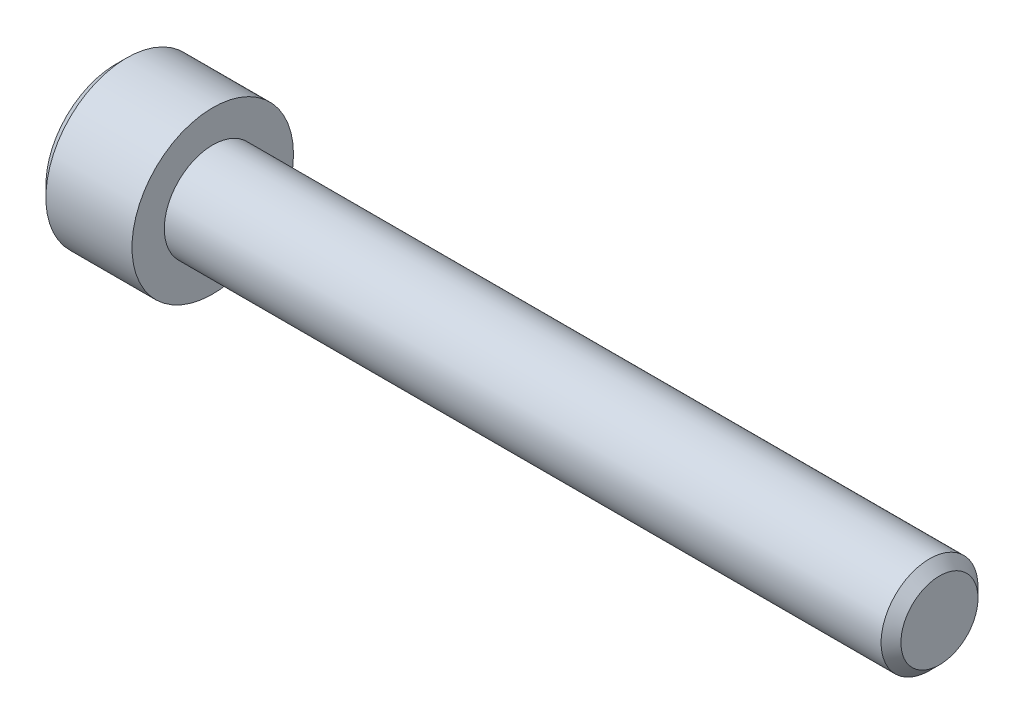
ISO-10303-21;
HEADER;
FILE_DESCRIPTION(('STEP AP214'),'2;1');
FILE_NAME('part.step','',(''),(''),'','','');
FILE_SCHEMA(('AUTOMOTIVE_DESIGN { 1 0 10303 214 1 1 1 1 }'));
ENDSEC;
DATA;
#1=APPLICATION_CONTEXT('core data for automotive mechanical design processes');
#2=APPLICATION_PROTOCOL_DEFINITION('international standard','automotive_design',2000,#1);
#3=PRODUCT_CONTEXT('',#1,'mechanical');
#4=PRODUCT('Part','Part','',(#3));
#5=PRODUCT_RELATED_PRODUCT_CATEGORY('part','',(#4));
#6=PRODUCT_DEFINITION_FORMATION('','',#4);
#7=PRODUCT_DEFINITION_CONTEXT('part definition',#1,'design');
#8=PRODUCT_DEFINITION('design','',#6,#7);
#9=PRODUCT_DEFINITION_SHAPE('','',#8);
#10=(LENGTH_UNIT() NAMED_UNIT(*) SI_UNIT(.MILLI.,.METRE.));
#11=(NAMED_UNIT(*) PLANE_ANGLE_UNIT() SI_UNIT($,.RADIAN.));
#12=(NAMED_UNIT(*) SI_UNIT($,.STERADIAN.) SOLID_ANGLE_UNIT());
#13=UNCERTAINTY_MEASURE_WITH_UNIT(LENGTH_MEASURE(1.E-05),#10,'distance_accuracy_value','');
#14=(GEOMETRIC_REPRESENTATION_CONTEXT(3) GLOBAL_UNCERTAINTY_ASSIGNED_CONTEXT((#13)) GLOBAL_UNIT_ASSIGNED_CONTEXT((#10,
#11,#12)) REPRESENTATION_CONTEXT('',''));
#15=CARTESIAN_POINT('',(0.,0.,0.));
#16=DIRECTION('',(0.,0.,1.));
#17=DIRECTION('',(1.,0.,0.));
#18=AXIS2_PLACEMENT_3D('',#15,#16,#17);
#19=CARTESIAN_POINT('',(-6.00000000000001,-1.11022302462516E-13,1.11022302462516E-13));
#20=DIRECTION('',(1.,0.,0.));
#21=DIRECTION('',(0.,0.,-1.));
#22=AXIS2_PLACEMENT_3D('',#19,#20,#21);
#23=PLANE('',#22);
#24=CARTESIAN_POINT('',(-6.00000000000001,-1.11022302462516E-13,1.11022302462516E-13));
#25=DIRECTION('',(1.,0.,0.));
#26=DIRECTION('',(0.,0.,-1.));
#27=AXIS2_PLACEMENT_3D('',#24,#25,#26);
#28=CIRCLE('',#27,4.33333333333333);
#29=CARTESIAN_POINT('',(-6.00000000000001,-1.13668334004539E-13,-4.33333333333322));
#30=VERTEX_POINT('',#29);
#31=EDGE_CURVE('E11',#30,#30,#28,.T.);
#32=ORIENTED_EDGE('',*,*,#31,.F.);
#33=EDGE_LOOP('',(#32));
#34=FACE_BOUND('',#33,.T.);
#35=DIRECTION('',(0.,0.499999999999999,-0.866025403784439));
#36=VECTOR('',#35,1.);
#37=CARTESIAN_POINT('',(-6.00000000000001,-2.88675134594821,0.));
#38=LINE('',#37,#36);
#39=CARTESIAN_POINT('',(-6.00000000000001,-2.88675134594821,0.));
#40=VERTEX_POINT('',#39);
#41=CARTESIAN_POINT('',(-6.00000000000001,-1.44337567297419,-2.50000000000006));
#42=VERTEX_POINT('',#41);
#43=EDGE_CURVE('E152',#40,#42,#38,.T.);
#44=ORIENTED_EDGE('',*,*,#43,.T.);
#45=DIRECTION('',(0.,0.999999999999999,0.));
#46=VECTOR('',#45,1.);
#47=CARTESIAN_POINT('',(-6.00000000000001,-1.44337567297419,-2.50000000000006));
#48=LINE('',#47,#46);
#49=CARTESIAN_POINT('',(-6.00000000000001,1.44337567297397,-2.49999999999995));
#50=VERTEX_POINT('',#49);
#51=EDGE_CURVE('E154',#42,#50,#48,.T.);
#52=ORIENTED_EDGE('',*,*,#51,.T.);
#53=DIRECTION('',(0.,0.5,0.866025403784439));
#54=VECTOR('',#53,1.);
#55=CARTESIAN_POINT('',(-6.00000000000001,1.44337567297397,-2.49999999999995));
#56=LINE('',#55,#54);
#57=CARTESIAN_POINT('',(-6.00000000000001,2.88675134594799,0.));
#58=VERTEX_POINT('',#57);
#59=EDGE_CURVE('E157',#50,#58,#56,.T.);
#60=ORIENTED_EDGE('',*,*,#59,.T.);
#61=DIRECTION('',(0.,-0.499999999999999,0.866025403784439));
#62=VECTOR('',#61,1.);
#63=CARTESIAN_POINT('',(-6.00000000000001,2.88675134594799,0.));
#64=LINE('',#63,#62);
#65=CARTESIAN_POINT('',(-6.00000000000001,1.44337567297384,2.50000000000011));
#66=VERTEX_POINT('',#65);
#67=EDGE_CURVE('E99',#58,#66,#64,.T.);
#68=ORIENTED_EDGE('',*,*,#67,.T.);
#69=DIRECTION('',(0.,-0.999999999999999,0.));
#70=VECTOR('',#69,1.);
#71=CARTESIAN_POINT('',(-6.00000000000001,1.44337567297384,2.50000000000011));
#72=LINE('',#71,#70);
#73=CARTESIAN_POINT('',(-6.00000000000001,-1.44337567297426,2.50000000000006));
#74=VERTEX_POINT('',#73);
#75=EDGE_CURVE('E159',#66,#74,#72,.T.);
#76=ORIENTED_EDGE('',*,*,#75,.T.);
#77=DIRECTION('',(0.,-0.5,-0.866025403784439));
#78=VECTOR('',#77,1.);
#79=CARTESIAN_POINT('',(-6.00000000000001,-1.44337567297426,2.50000000000006));
#80=LINE('',#79,#78);
#81=EDGE_CURVE('E114',#74,#40,#80,.T.);
#82=ORIENTED_EDGE('',*,*,#81,.T.);
#83=EDGE_LOOP('',(#44,#52,#60,#68,#76,#82));
#84=FACE_BOUND('',#83,.T.);
#85=ADVANCED_FACE('F16',(#34,#84),#23,.F.);
#86=CARTESIAN_POINT('',(-6.00000000000001,-1.11022302462516E-13,1.11022302462516E-13));
#87=DIRECTION('',(1.,0.,0.));
#88=DIRECTION('',(0.,0.,-1.));
#89=AXIS2_PLACEMENT_3D('',#86,#87,#88);
#90=CONICAL_SURFACE('',#89,4.33333333333333,0.785398163397452);
#91=CARTESIAN_POINT('',(-5.3333333333333,0.,0.));
#92=DIRECTION('',(1.,0.,0.));
#93=DIRECTION('',(0.,0.,-1.));
#94=AXIS2_PLACEMENT_3D('',#91,#92,#93);
#95=CIRCLE('',#94,5.);
#96=CARTESIAN_POINT('',(-5.3333333333333,0.,-4.99999999999994));
#97=VERTEX_POINT('',#96);
#98=EDGE_CURVE('E23',#97,#97,#95,.T.);
#99=ORIENTED_EDGE('',*,*,#98,.F.);
#100=EDGE_LOOP('',(#99));
#101=FACE_BOUND('',#100,.T.);
#102=ORIENTED_EDGE('',*,*,#31,.T.);
#103=EDGE_LOOP('',(#102));
#104=FACE_BOUND('',#103,.T.);
#105=ADVANCED_FACE('F143',(#101,#104),#90,.T.);
#106=CARTESIAN_POINT('',(45.,-1.2490009027033E-13,0.));
#107=DIRECTION('',(1.,0.,0.));
#108=DIRECTION('',(0.,0.,-1.));
#109=AXIS2_PLACEMENT_3D('',#106,#107,#108);
#110=CYLINDRICAL_SURFACE('',#109,5.);
#111=CARTESIAN_POINT('',(0.,0.,0.));
#112=DIRECTION('',(1.,0.,0.));
#113=DIRECTION('',(0.,0.,-1.));
#114=AXIS2_PLACEMENT_3D('',#111,#112,#113);
#115=CIRCLE('',#114,5.);
#116=CARTESIAN_POINT('',(0.,0.,-5.));
#117=VERTEX_POINT('',#116);
#118=EDGE_CURVE('E136',#117,#117,#115,.T.);
#119=ORIENTED_EDGE('',*,*,#118,.F.);
#120=EDGE_LOOP('',(#119));
#121=FACE_BOUND('',#120,.T.);
#122=ORIENTED_EDGE('',*,*,#98,.T.);
#123=EDGE_LOOP('',(#122));
#124=FACE_BOUND('',#123,.T.);
#125=ADVANCED_FACE('F141',(#121,#124),#110,.T.);
#126=CARTESIAN_POINT('',(0.,4.99999999999991,0.));
#127=DIRECTION('',(-1.,0.,0.));
#128=DIRECTION('',(0.,0.,1.));
#129=AXIS2_PLACEMENT_3D('',#126,#127,#128);
#130=PLANE('',#129);
#131=CARTESIAN_POINT('',(0.,0.,0.));
#132=DIRECTION('',(1.,0.,0.));
#133=DIRECTION('',(0.,0.,-1.));
#134=AXIS2_PLACEMENT_3D('',#131,#132,#133);
#135=CIRCLE('',#134,3.);
#136=CARTESIAN_POINT('',(0.,0.,-3.));
#137=VERTEX_POINT('',#136);
#138=EDGE_CURVE('E133',#137,#137,#135,.T.);
#139=ORIENTED_EDGE('',*,*,#138,.F.);
#140=EDGE_LOOP('',(#139));
#141=FACE_BOUND('',#140,.T.);
#142=ORIENTED_EDGE('',*,*,#118,.T.);
#143=EDGE_LOOP('',(#142));
#144=FACE_BOUND('',#143,.T.);
#145=ADVANCED_FACE('F251',(#141,#144),#130,.F.);
#146=CARTESIAN_POINT('',(45.,-1.2490009027033E-13,0.));
#147=DIRECTION('',(1.,0.,0.));
#148=DIRECTION('',(0.,0.,-1.));
#149=AXIS2_PLACEMENT_3D('',#146,#147,#148);
#150=CYLINDRICAL_SURFACE('',#149,3.);
#151=CARTESIAN_POINT('',(44.3865,-1.2490009027033E-13,0.));
#152=DIRECTION('',(1.,0.,0.));
#153=DIRECTION('',(0.,0.,-1.));
#154=AXIS2_PLACEMENT_3D('',#151,#152,#153);
#155=CIRCLE('',#154,3.);
#156=CARTESIAN_POINT('',(44.3865,-1.26731958260962E-13,-3.));
#157=VERTEX_POINT('',#156);
#158=EDGE_CURVE('E130',#157,#157,#155,.T.);
#159=ORIENTED_EDGE('',*,*,#158,.F.);
#160=EDGE_LOOP('',(#159));
#161=FACE_BOUND('',#160,.T.);
#162=ORIENTED_EDGE('',*,*,#138,.T.);
#163=EDGE_LOOP('',(#162));
#164=FACE_BOUND('',#163,.T.);
#165=ADVANCED_FACE('F247',(#161,#164),#150,.T.);
#166=CARTESIAN_POINT('',(44.3865,-1.2490009027033E-13,0.));
#167=DIRECTION('',(-1.,0.,0.));
#168=DIRECTION('',(0.,0.,1.));
#169=AXIS2_PLACEMENT_3D('',#166,#167,#168);
#170=CONICAL_SURFACE('',#169,3.,0.785398163397452);
#171=CARTESIAN_POINT('',(45.,-1.2490009027033E-13,0.));
#172=DIRECTION('',(1.,0.,0.));
#173=DIRECTION('',(0.,0.,-1.));
#174=AXIS2_PLACEMENT_3D('',#171,#172,#173);
#175=CIRCLE('',#174,2.3865);
#176=CARTESIAN_POINT('',(45.,-1.26357341256877E-13,-2.3865));
#177=VERTEX_POINT('',#176);
#178=EDGE_CURVE('E126',#177,#177,#175,.T.);
#179=ORIENTED_EDGE('',*,*,#178,.F.);
#180=EDGE_LOOP('',(#179));
#181=FACE_BOUND('',#180,.T.);
#182=ORIENTED_EDGE('',*,*,#158,.T.);
#183=EDGE_LOOP('',(#182));
#184=FACE_BOUND('',#183,.T.);
#185=ADVANCED_FACE('F243',(#181,#184),#170,.T.);
#186=CARTESIAN_POINT('',(45.,2.38649999999989,1.11022302462516E-13));
#187=DIRECTION('',(-1.,0.,0.));
#188=DIRECTION('',(0.,0.,1.));
#189=AXIS2_PLACEMENT_3D('',#186,#187,#188);
#190=PLANE('',#189);
#191=ORIENTED_EDGE('',*,*,#178,.T.);
#192=EDGE_LOOP('',(#191));
#193=FACE_BOUND('',#192,.T.);
#194=ADVANCED_FACE('F238',(#193),#190,.F.);
#195=CARTESIAN_POINT('',(-3.,1.44337567297373,2.50000000000011));
#196=DIRECTION('',(0.,0.,-1.));
#197=DIRECTION('',(-1.,0.,0.));
#198=AXIS2_PLACEMENT_3D('',#195,#196,#197);
#199=PLANE('',#198);
#200=ORIENTED_EDGE('',*,*,#75,.F.);
#201=DIRECTION('',(-1.,0.,0.));
#202=VECTOR('',#201,1.);
#203=CARTESIAN_POINT('',(-3.,1.44337567297373,2.50000000000011));
#204=LINE('',#203,#202);
#205=CARTESIAN_POINT('',(-3.,1.44337567297373,2.50000000000011));
#206=VERTEX_POINT('',#205);
#207=EDGE_CURVE('E166',#206,#66,#204,.T.);
#208=ORIENTED_EDGE('',*,*,#207,.F.);
#209=DIRECTION('',(0.,-0.999999999999999,0.));
#210=VECTOR('',#209,1.);
#211=CARTESIAN_POINT('',(-3.,1.44337567297373,2.50000000000011));
#212=LINE('',#211,#210);
#213=CARTESIAN_POINT('',(-3.,-1.52655665885959E-13,2.50000000000011));
#214=VERTEX_POINT('',#213);
#215=EDGE_CURVE('E96',#206,#214,#212,.T.);
#216=ORIENTED_EDGE('',*,*,#215,.T.);
#217=CARTESIAN_POINT('',(-3.,-1.44337567297417,2.5));
#218=VERTEX_POINT('',#217);
#219=EDGE_CURVE('E88',#214,#218,#212,.T.);
#220=ORIENTED_EDGE('',*,*,#219,.T.);
#221=DIRECTION('',(-1.,0.,0.));
#222=VECTOR('',#221,1.);
#223=CARTESIAN_POINT('',(-3.,-1.44337567297417,2.5));
#224=LINE('',#223,#222);
#225=EDGE_CURVE('E92',#218,#74,#224,.T.);
#226=ORIENTED_EDGE('',*,*,#225,.T.);
#227=EDGE_LOOP('',(#200,#208,#216,#220,#226));
#228=FACE_BOUND('',#227,.T.);
#229=ADVANCED_FACE('F90',(#228),#199,.T.);
#230=CARTESIAN_POINT('',(-3.,-1.44337567297417,2.5));
#231=DIRECTION('',(0.,0.866025403784439,-0.5));
#232=DIRECTION('',(0.,0.5,0.866025403784439));
#233=AXIS2_PLACEMENT_3D('',#230,#231,#232);
#234=PLANE('',#233);
#235=ORIENTED_EDGE('',*,*,#81,.F.);
#236=ORIENTED_EDGE('',*,*,#225,.F.);
#237=DIRECTION('',(0.,-0.5,-0.866025403784439));
#238=VECTOR('',#237,1.);
#239=CARTESIAN_POINT('',(-3.,-1.44337567297417,2.5));
#240=LINE('',#239,#238);
#241=CARTESIAN_POINT('',(-3.,-2.16506350946126,1.24999999999997));
#242=VERTEX_POINT('',#241);
#243=EDGE_CURVE('E102',#218,#242,#240,.T.);
#244=ORIENTED_EDGE('',*,*,#243,.T.);
#245=CARTESIAN_POINT('',(-3.,-2.88675134594822,0.));
#246=VERTEX_POINT('',#245);
#247=EDGE_CURVE('E109',#242,#246,#240,.T.);
#248=ORIENTED_EDGE('',*,*,#247,.T.);
#249=DIRECTION('',(-1.,0.,0.));
#250=VECTOR('',#249,1.);
#251=CARTESIAN_POINT('',(-3.,-2.88675134594822,0.));
#252=LINE('',#251,#250);
#253=EDGE_CURVE('E116',#246,#40,#252,.T.);
#254=ORIENTED_EDGE('',*,*,#253,.T.);
#255=EDGE_LOOP('',(#235,#236,#244,#248,#254));
#256=FACE_BOUND('',#255,.T.);
#257=ADVANCED_FACE('F111',(#256),#234,.T.);
#258=CARTESIAN_POINT('',(-3.,-2.88675134594822,0.));
#259=DIRECTION('',(0.,0.866025403784439,0.5));
#260=DIRECTION('',(0.,-0.499999999999999,0.866025403784439));
#261=AXIS2_PLACEMENT_3D('',#258,#259,#260);
#262=PLANE('',#261);
#263=ORIENTED_EDGE('',*,*,#43,.F.);
#264=ORIENTED_EDGE('',*,*,#253,.F.);
#265=DIRECTION('',(0.,0.499999999999999,-0.866025403784439));
#266=VECTOR('',#265,1.);
#267=CARTESIAN_POINT('',(-3.,-2.88675134594822,0.));
#268=LINE('',#267,#266);
#269=CARTESIAN_POINT('',(-3.,-2.16506350946123,-1.25000000000003));
#270=VERTEX_POINT('',#269);
#271=EDGE_CURVE('E30',#246,#270,#268,.T.);
#272=ORIENTED_EDGE('',*,*,#271,.T.);
#273=CARTESIAN_POINT('',(-3.,-1.4433756729743,-2.5));
#274=VERTEX_POINT('',#273);
#275=EDGE_CURVE('E108',#270,#274,#268,.T.);
#276=ORIENTED_EDGE('',*,*,#275,.T.);
#277=DIRECTION('',(-1.,0.,0.));
#278=VECTOR('',#277,1.);
#279=CARTESIAN_POINT('',(-3.,-1.4433756729743,-2.5));
#280=LINE('',#279,#278);
#281=EDGE_CURVE('E122',#274,#42,#280,.T.);
#282=ORIENTED_EDGE('',*,*,#281,.T.);
#283=EDGE_LOOP('',(#263,#264,#272,#276,#282));
#284=FACE_BOUND('',#283,.T.);
#285=ADVANCED_FACE('F176',(#284),#262,.T.);
#286=CARTESIAN_POINT('',(-3.,-1.4433756729743,-2.5));
#287=DIRECTION('',(0.,0.,1.));
#288=DIRECTION('',(1.,0.,0.));
#289=AXIS2_PLACEMENT_3D('',#286,#287,#288);
#290=PLANE('',#289);
#291=ORIENTED_EDGE('',*,*,#51,.F.);
#292=ORIENTED_EDGE('',*,*,#281,.F.);
#293=DIRECTION('',(0.,0.999999999999999,0.));
#294=VECTOR('',#293,1.);
#295=CARTESIAN_POINT('',(-3.,-1.4433756729743,-2.5));
#296=LINE('',#295,#294);
#297=CARTESIAN_POINT('',(-3.,0.,-2.50000000000006));
#298=VERTEX_POINT('',#297);
#299=EDGE_CURVE('E181',#274,#298,#296,.T.);
#300=ORIENTED_EDGE('',*,*,#299,.T.);
#301=CARTESIAN_POINT('',(-3.,1.44337567297392,-2.49999999999984));
#302=VERTEX_POINT('',#301);
#303=EDGE_CURVE('E189',#298,#302,#296,.T.);
#304=ORIENTED_EDGE('',*,*,#303,.T.);
#305=DIRECTION('',(-1.,0.,0.));
#306=VECTOR('',#305,1.);
#307=CARTESIAN_POINT('',(-3.,1.44337567297392,-2.49999999999984));
#308=LINE('',#307,#306);
#309=EDGE_CURVE('E173',#302,#50,#308,.T.);
#310=ORIENTED_EDGE('',*,*,#309,.T.);
#311=EDGE_LOOP('',(#291,#292,#300,#304,#310));
#312=FACE_BOUND('',#311,.T.);
#313=ADVANCED_FACE('F180',(#312),#290,.T.);
#314=CARTESIAN_POINT('',(-3.,1.44337567297392,-2.49999999999984));
#315=DIRECTION('',(0.,-0.866025403784439,0.5));
#316=DIRECTION('',(0.,-0.5,-0.866025403784439));
#317=AXIS2_PLACEMENT_3D('',#314,#315,#316);
#318=PLANE('',#317);
#319=ORIENTED_EDGE('',*,*,#59,.F.);
#320=ORIENTED_EDGE('',*,*,#309,.F.);
#321=DIRECTION('',(0.,0.5,0.866025403784439));
#322=VECTOR('',#321,1.);
#323=CARTESIAN_POINT('',(-3.,1.44337567297392,-2.49999999999984));
#324=LINE('',#323,#322);
#325=CARTESIAN_POINT('',(-3.,2.16506350946087,-1.25000000000008));
#326=VERTEX_POINT('',#325);
#327=EDGE_CURVE('E191',#302,#326,#324,.T.);
#328=ORIENTED_EDGE('',*,*,#327,.T.);
#329=CARTESIAN_POINT('',(-3.,2.88675134594805,0.));
#330=VERTEX_POINT('',#329);
#331=EDGE_CURVE('E188',#326,#330,#324,.T.);
#332=ORIENTED_EDGE('',*,*,#331,.T.);
#333=DIRECTION('',(-1.,0.,0.));
#334=VECTOR('',#333,1.);
#335=CARTESIAN_POINT('',(-3.,2.88675134594805,0.));
#336=LINE('',#335,#334);
#337=EDGE_CURVE('E169',#330,#58,#336,.T.);
#338=ORIENTED_EDGE('',*,*,#337,.T.);
#339=EDGE_LOOP('',(#319,#320,#328,#332,#338));
#340=FACE_BOUND('',#339,.T.);
#341=ADVANCED_FACE('F219',(#340),#318,.T.);
#342=CARTESIAN_POINT('',(-3.,2.88675134594805,0.));
#343=DIRECTION('',(0.,-0.866025403784439,-0.5));
#344=DIRECTION('',(0.,0.499999999999999,-0.866025403784439));
#345=AXIS2_PLACEMENT_3D('',#342,#343,#344);
#346=PLANE('',#345);
#347=ORIENTED_EDGE('',*,*,#67,.F.);
#348=ORIENTED_EDGE('',*,*,#337,.F.);
#349=DIRECTION('',(0.,-0.499999999999999,0.866025403784439));
#350=VECTOR('',#349,1.);
#351=CARTESIAN_POINT('',(-3.,2.88675134594805,0.));
#352=LINE('',#351,#350);
#353=CARTESIAN_POINT('',(-3.,2.16506350946091,1.24999999999997));
#354=VERTEX_POINT('',#353);
#355=EDGE_CURVE('E170',#330,#354,#352,.T.);
#356=ORIENTED_EDGE('',*,*,#355,.T.);
#357=EDGE_CURVE('E196',#354,#206,#352,.T.);
#358=ORIENTED_EDGE('',*,*,#357,.T.);
#359=ORIENTED_EDGE('',*,*,#207,.T.);
#360=EDGE_LOOP('',(#347,#348,#356,#358,#359));
#361=FACE_BOUND('',#360,.T.);
#362=ADVANCED_FACE('F199',(#361),#346,.T.);
#363=CARTESIAN_POINT('',(-3.,0.,0.));
#364=DIRECTION('',(1.,0.,0.));
#365=DIRECTION('',(0.,0.,-1.));
#366=AXIS2_PLACEMENT_3D('',#363,#364,#365);
#367=PLANE('',#366);
#368=CARTESIAN_POINT('',(-3.,0.,0.));
#369=DIRECTION('',(1.,0.,0.));
#370=DIRECTION('',(0.,0.,-1.));
#371=AXIS2_PLACEMENT_3D('',#368,#369,#370);
#372=CIRCLE('',#371,2.5);
#373=EDGE_CURVE('E115',#298,#326,#372,.T.);
#374=ORIENTED_EDGE('',*,*,#373,.T.);
#375=ORIENTED_EDGE('',*,*,#327,.F.);
#376=ORIENTED_EDGE('',*,*,#303,.F.);
#377=EDGE_LOOP('',(#374,#375,#376));
#378=FACE_BOUND('',#377,.T.);
#379=ADVANCED_FACE('F214',(#378),#367,.F.);
#380=ORIENTED_EDGE('',*,*,#331,.F.);
#381=EDGE_CURVE('E121',#326,#354,#372,.T.);
#382=ORIENTED_EDGE('',*,*,#381,.T.);
#383=ORIENTED_EDGE('',*,*,#355,.F.);
#384=EDGE_LOOP('',(#380,#382,#383));
#385=FACE_BOUND('',#384,.T.);
#386=ADVANCED_FACE('F216',(#385),#367,.F.);
#387=EDGE_CURVE('E127',#354,#214,#372,.T.);
#388=ORIENTED_EDGE('',*,*,#387,.T.);
#389=ORIENTED_EDGE('',*,*,#215,.F.);
#390=ORIENTED_EDGE('',*,*,#357,.F.);
#391=EDGE_LOOP('',(#388,#389,#390));
#392=FACE_BOUND('',#391,.T.);
#393=ADVANCED_FACE('F205',(#392),#367,.F.);
#394=EDGE_CURVE('E104',#214,#242,#372,.T.);
#395=ORIENTED_EDGE('',*,*,#394,.T.);
#396=ORIENTED_EDGE('',*,*,#243,.F.);
#397=ORIENTED_EDGE('',*,*,#219,.F.);
#398=EDGE_LOOP('',(#395,#396,#397));
#399=FACE_BOUND('',#398,.T.);
#400=ADVANCED_FACE('F103',(#399),#367,.F.);
#401=EDGE_CURVE('E208',#242,#270,#372,.T.);
#402=ORIENTED_EDGE('',*,*,#401,.T.);
#403=ORIENTED_EDGE('',*,*,#271,.F.);
#404=ORIENTED_EDGE('',*,*,#247,.F.);
#405=EDGE_LOOP('',(#402,#403,#404));
#406=FACE_BOUND('',#405,.T.);
#407=ADVANCED_FACE('F207',(#406),#367,.F.);
#408=EDGE_CURVE('E119',#270,#298,#372,.T.);
#409=ORIENTED_EDGE('',*,*,#408,.T.);
#410=ORIENTED_EDGE('',*,*,#299,.F.);
#411=ORIENTED_EDGE('',*,*,#275,.F.);
#412=EDGE_LOOP('',(#409,#410,#411));
#413=FACE_BOUND('',#412,.T.);
#414=ADVANCED_FACE('F184',(#413),#367,.F.);
#415=CARTESIAN_POINT('',(-3.,0.,0.));
#416=DIRECTION('',(-1.,0.,0.));
#417=DIRECTION('',(0.,0.,1.));
#418=AXIS2_PLACEMENT_3D('',#415,#416,#417);
#419=CONICAL_SURFACE('',#418,2.5,1.30899693899575);
#420=CARTESIAN_POINT('',(-2.33012701892221,0.,0.));
#421=VERTEX_POINT('',#420);
#422=VERTEX_LOOP('',#421);
#423=FACE_BOUND('',#422,.T.);
#424=ORIENTED_EDGE('',*,*,#381,.F.);
#425=ORIENTED_EDGE('',*,*,#373,.F.);
#426=ORIENTED_EDGE('',*,*,#408,.F.);
#427=ORIENTED_EDGE('',*,*,#401,.F.);
#428=ORIENTED_EDGE('',*,*,#394,.F.);
#429=ORIENTED_EDGE('',*,*,#387,.F.);
#430=EDGE_LOOP('',(#424,#425,#426,#427,#428,#429));
#431=FACE_BOUND('',#430,.T.);
#432=ADVANCED_FACE('F210',(#423,#431),#419,.F.);
#433=CLOSED_SHELL('',(#85,#105,#125,#145,#165,#185,#194,#229,#257,#285,#313,#341,#362,#379,#386,
#393,#400,#407,#414,#432));
#434=MANIFOLD_SOLID_BREP('B1',#433);
#435=ADVANCED_BREP_SHAPE_REPRESENTATION('',(#18,#434),#14);
#436=SHAPE_DEFINITION_REPRESENTATION(#9,#435);
ENDSEC;
END-ISO-10303-21;
